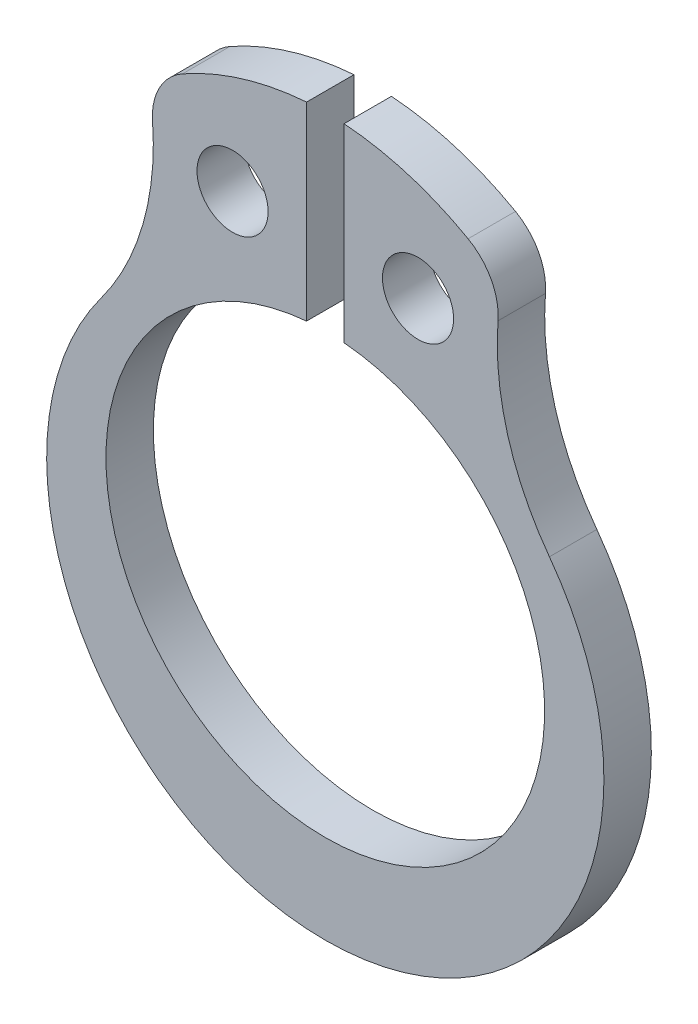
ISO-10303-21;
HEADER;
FILE_DESCRIPTION(('STEP AP214'),'2;1');
FILE_NAME('part.step','',(''),(''),'','','');
FILE_SCHEMA(('AUTOMOTIVE_DESIGN { 1 0 10303 214 1 1 1 1 }'));
ENDSEC;
DATA;
#1=APPLICATION_CONTEXT('core data for automotive mechanical design processes');
#2=APPLICATION_PROTOCOL_DEFINITION('international standard','automotive_design',2000,#1);
#3=PRODUCT_CONTEXT('',#1,'mechanical');
#4=PRODUCT('Part','Part','',(#3));
#5=PRODUCT_RELATED_PRODUCT_CATEGORY('part','',(#4));
#6=PRODUCT_DEFINITION_FORMATION('','',#4);
#7=PRODUCT_DEFINITION_CONTEXT('part definition',#1,'design');
#8=PRODUCT_DEFINITION('design','',#6,#7);
#9=PRODUCT_DEFINITION_SHAPE('','',#8);
#10=(LENGTH_UNIT() NAMED_UNIT(*) SI_UNIT(.MILLI.,.METRE.));
#11=(NAMED_UNIT(*) PLANE_ANGLE_UNIT() SI_UNIT($,.RADIAN.));
#12=(NAMED_UNIT(*) SI_UNIT($,.STERADIAN.) SOLID_ANGLE_UNIT());
#13=UNCERTAINTY_MEASURE_WITH_UNIT(LENGTH_MEASURE(1.E-05),#10,'distance_accuracy_value','');
#14=(GEOMETRIC_REPRESENTATION_CONTEXT(3) GLOBAL_UNCERTAINTY_ASSIGNED_CONTEXT((#13)) GLOBAL_UNIT_ASSIGNED_CONTEXT((#10,
#11,#12)) REPRESENTATION_CONTEXT('',''));
#15=CARTESIAN_POINT('',(0.,0.,0.));
#16=DIRECTION('',(0.,0.,1.));
#17=DIRECTION('',(1.,0.,0.));
#18=AXIS2_PLACEMENT_3D('',#15,#16,#17);
#19=CARTESIAN_POINT('',(0.0529035837753273,1.90010865412822,0.4));
#20=DIRECTION('',(0.,0.,1.));
#21=DIRECTION('',(1.,0.,0.));
#22=AXIS2_PLACEMENT_3D('',#19,#20,#21);
#23=PLANE('',#22);
#24=CARTESIAN_POINT('',(-1.56469076255837,4.95900623286204,0.4));
#25=DIRECTION('',(0.,0.,1.));
#26=DIRECTION('',(1.,0.,0.));
#27=AXIS2_PLACEMENT_3D('',#24,#25,#26);
#28=CIRCLE('',#27,0.6);
#29=CARTESIAN_POINT('',(-0.964690762558365,4.95900623286204,0.4));
#30=VERTEX_POINT('',#29);
#31=EDGE_CURVE('E150',#30,#30,#28,.T.);
#32=ORIENTED_EDGE('',*,*,#31,.F.);
#33=EDGE_LOOP('',(#32));
#34=FACE_BOUND('',#33,.T.);
#35=CARTESIAN_POINT('',(0.0529035837753273,1.90010865412822,0.4));
#36=DIRECTION('',(0.,0.,1.));
#37=DIRECTION('',(1.,0.,0.));
#38=AXIS2_PLACEMENT_3D('',#35,#36,#37);
#39=CIRCLE('',#38,5.);
#40=CARTESIAN_POINT('',(-0.31601290124631,6.88648014320516,0.4));
#41=VERTEX_POINT('',#40);
#42=CARTESIAN_POINT('',(-2.40895037591621,6.2520363972268,0.4));
#43=VERTEX_POINT('',#42);
#44=EDGE_CURVE('E165',#41,#43,#39,.T.);
#45=ORIENTED_EDGE('',*,*,#44,.T.);
#46=CARTESIAN_POINT('',(-1.9165795839779,5.38165084860709,0.4));
#47=DIRECTION('',(0.,0.,1.));
#48=DIRECTION('',(1.,0.,0.));
#49=AXIS2_PLACEMENT_3D('',#46,#47,#48);
#50=CIRCLE('',#49,0.999999999999999);
#51=CARTESIAN_POINT('',(-2.91370870399395,5.30593085114258,0.4));
#52=VERTEX_POINT('',#51);
#53=EDGE_CURVE('E103',#43,#52,#50,.T.);
#54=ORIENTED_EDGE('',*,*,#53,.T.);
#55=CARTESIAN_POINT('',(-7.40078974406616,4.9651908625523,0.4));
#56=DIRECTION('',(0.,0.,-1.));
#57=DIRECTION('',(-1.,0.,0.));
#58=AXIS2_PLACEMENT_3D('',#55,#56,#57);
#59=CIRCLE('',#58,4.5);
#60=CARTESIAN_POINT('',(-3.7808382388164,2.29199967978215,0.4));
#61=VERTEX_POINT('',#60);
#62=EDGE_CURVE('E186',#52,#61,#59,.T.);
#63=ORIENTED_EDGE('',*,*,#62,.T.);
#64=CARTESIAN_POINT('',(0.,-0.5,0.4));
#65=DIRECTION('',(0.,0.,1.));
#66=DIRECTION('',(1.,0.,0.));
#67=AXIS2_PLACEMENT_3D('',#64,#65,#66);
#68=CIRCLE('',#67,4.69999999999999);
#69=CARTESIAN_POINT('',(3.78083823881638,2.29199967978215,0.4));
#70=VERTEX_POINT('',#69);
#71=EDGE_CURVE('E205',#61,#70,#68,.T.);
#72=ORIENTED_EDGE('',*,*,#71,.T.);
#73=CARTESIAN_POINT('',(7.40078974406612,4.9651908625523,0.4));
#74=DIRECTION('',(0.,0.,-1.));
#75=DIRECTION('',(1.,0.,0.));
#76=AXIS2_PLACEMENT_3D('',#73,#74,#75);
#77=CIRCLE('',#76,4.49999999999999);
#78=CARTESIAN_POINT('',(2.91370870399391,5.30593085114258,0.4));
#79=VERTEX_POINT('',#78);
#80=EDGE_CURVE('E202',#70,#79,#77,.T.);
#81=ORIENTED_EDGE('',*,*,#80,.T.);
#82=CARTESIAN_POINT('',(1.91657958397786,5.38165084860709,0.4));
#83=DIRECTION('',(0.,0.,1.));
#84=DIRECTION('',(-1.,0.,0.));
#85=AXIS2_PLACEMENT_3D('',#82,#83,#84);
#86=CIRCLE('',#85,0.999999999999997);
#87=CARTESIAN_POINT('',(2.40895037591617,6.25203639722681,0.4));
#88=VERTEX_POINT('',#87);
#89=EDGE_CURVE('E204',#79,#88,#86,.T.);
#90=ORIENTED_EDGE('',*,*,#89,.T.);
#91=CARTESIAN_POINT('',(-0.0529035837753406,1.90010865412822,0.4));
#92=DIRECTION('',(0.,0.,1.));
#93=DIRECTION('',(-1.,0.,0.));
#94=AXIS2_PLACEMENT_3D('',#91,#92,#93);
#95=CIRCLE('',#94,4.99999999999999);
#96=CARTESIAN_POINT('',(0.316012901246262,6.88648014320516,0.4));
#97=VERTEX_POINT('',#96);
#98=EDGE_CURVE('E128',#88,#97,#95,.T.);
#99=ORIENTED_EDGE('',*,*,#98,.T.);
#100=DIRECTION('',(0.,-1.,0.));
#101=VECTOR('',#100,1.);
#102=CARTESIAN_POINT('',(0.316012901246262,6.88648014320516,0.4));
#103=LINE('',#102,#101);
#104=CARTESIAN_POINT('',(0.316012901246284,3.68648014320516,0.4));
#105=VERTEX_POINT('',#104);
#106=EDGE_CURVE('E122',#97,#105,#103,.T.);
#107=ORIENTED_EDGE('',*,*,#106,.T.);
#108=CARTESIAN_POINT('',(0.,0.,0.4));
#109=DIRECTION('',(0.,0.,-1.));
#110=DIRECTION('',(1.,0.,0.));
#111=AXIS2_PLACEMENT_3D('',#108,#109,#110);
#112=CIRCLE('',#111,3.7);
#113=CARTESIAN_POINT('',(-0.31601290124631,3.68648014320515,0.4));
#114=VERTEX_POINT('',#113);
#115=EDGE_CURVE('E126',#105,#114,#112,.T.);
#116=ORIENTED_EDGE('',*,*,#115,.T.);
#117=DIRECTION('',(0.,1.,0.));
#118=VECTOR('',#117,1.);
#119=CARTESIAN_POINT('',(-0.31601290124631,6.88648014320516,0.4));
#120=LINE('',#119,#118);
#121=EDGE_CURVE('E54',#114,#41,#120,.T.);
#122=ORIENTED_EDGE('',*,*,#121,.T.);
#123=EDGE_LOOP('',(#45,#54,#63,#72,#81,#90,#99,#107,#116,#122));
#124=FACE_BOUND('',#123,.T.);
#125=CARTESIAN_POINT('',(1.56469076255833,4.95900623286204,0.4));
#126=DIRECTION('',(0.,0.,1.));
#127=DIRECTION('',(-1.,0.,0.));
#128=AXIS2_PLACEMENT_3D('',#125,#126,#127);
#129=CIRCLE('',#128,0.600000000000001);
#130=CARTESIAN_POINT('',(0.96469076255833,4.95900623286204,0.4));
#131=VERTEX_POINT('',#130);
#132=EDGE_CURVE('E216',#131,#131,#129,.T.);
#133=ORIENTED_EDGE('',*,*,#132,.F.);
#134=EDGE_LOOP('',(#133));
#135=FACE_BOUND('',#134,.T.);
#136=ADVANCED_FACE('F37',(#34,#124,#135),#23,.T.);
#137=CARTESIAN_POINT('',(0.0529035837753273,1.90010865412822,-0.4));
#138=DIRECTION('',(0.,0.,1.));
#139=DIRECTION('',(1.,0.,0.));
#140=AXIS2_PLACEMENT_3D('',#137,#138,#139);
#141=PLANE('',#140);
#142=CARTESIAN_POINT('',(0.0529035837753273,1.90010865412822,-0.4));
#143=DIRECTION('',(0.,0.,1.));
#144=DIRECTION('',(1.,0.,0.));
#145=AXIS2_PLACEMENT_3D('',#142,#143,#144);
#146=CIRCLE('',#145,5.);
#147=CARTESIAN_POINT('',(-0.31601290124631,6.88648014320516,-0.4));
#148=VERTEX_POINT('',#147);
#149=CARTESIAN_POINT('',(-2.40895037591621,6.2520363972268,-0.4));
#150=VERTEX_POINT('',#149);
#151=EDGE_CURVE('E146',#148,#150,#146,.T.);
#152=ORIENTED_EDGE('',*,*,#151,.F.);
#153=DIRECTION('',(0.,1.,0.));
#154=VECTOR('',#153,1.);
#155=CARTESIAN_POINT('',(-0.31601290124631,6.88648014320516,-0.4));
#156=LINE('',#155,#154);
#157=CARTESIAN_POINT('',(-0.31601290124631,3.68648014320515,-0.4));
#158=VERTEX_POINT('',#157);
#159=EDGE_CURVE('E95',#158,#148,#156,.T.);
#160=ORIENTED_EDGE('',*,*,#159,.F.);
#161=CARTESIAN_POINT('',(0.,0.,-0.4));
#162=DIRECTION('',(0.,0.,-1.));
#163=DIRECTION('',(1.,0.,0.));
#164=AXIS2_PLACEMENT_3D('',#161,#162,#163);
#165=CIRCLE('',#164,3.7);
#166=CARTESIAN_POINT('',(0.316012901246284,3.68648014320516,-0.4));
#167=VERTEX_POINT('',#166);
#168=EDGE_CURVE('E89',#167,#158,#165,.T.);
#169=ORIENTED_EDGE('',*,*,#168,.F.);
#170=DIRECTION('',(0.,-1.,0.));
#171=VECTOR('',#170,1.);
#172=CARTESIAN_POINT('',(0.316012901246262,6.88648014320516,-0.4));
#173=LINE('',#172,#171);
#174=CARTESIAN_POINT('',(0.316012901246262,6.88648014320516,-0.4));
#175=VERTEX_POINT('',#174);
#176=EDGE_CURVE('E136',#175,#167,#173,.T.);
#177=ORIENTED_EDGE('',*,*,#176,.F.);
#178=CARTESIAN_POINT('',(-0.0529035837753406,1.90010865412822,-0.4));
#179=DIRECTION('',(0.,0.,1.));
#180=DIRECTION('',(-1.,0.,0.));
#181=AXIS2_PLACEMENT_3D('',#178,#179,#180);
#182=CIRCLE('',#181,4.99999999999999);
#183=CARTESIAN_POINT('',(2.40895037591617,6.25203639722681,-0.4));
#184=VERTEX_POINT('',#183);
#185=EDGE_CURVE('E160',#184,#175,#182,.T.);
#186=ORIENTED_EDGE('',*,*,#185,.F.);
#187=CARTESIAN_POINT('',(1.91657958397786,5.38165084860709,-0.4));
#188=DIRECTION('',(0.,0.,1.));
#189=DIRECTION('',(-1.,0.,0.));
#190=AXIS2_PLACEMENT_3D('',#187,#188,#189);
#191=CIRCLE('',#190,0.999999999999997);
#192=CARTESIAN_POINT('',(2.91370870399391,5.30593085114258,-0.4));
#193=VERTEX_POINT('',#192);
#194=EDGE_CURVE('E158',#193,#184,#191,.T.);
#195=ORIENTED_EDGE('',*,*,#194,.F.);
#196=CARTESIAN_POINT('',(7.40078974406612,4.9651908625523,-0.4));
#197=DIRECTION('',(0.,0.,-1.));
#198=DIRECTION('',(1.,0.,0.));
#199=AXIS2_PLACEMENT_3D('',#196,#197,#198);
#200=CIRCLE('',#199,4.49999999999999);
#201=CARTESIAN_POINT('',(3.78083823881638,2.29199967978215,-0.4));
#202=VERTEX_POINT('',#201);
#203=EDGE_CURVE('E156',#202,#193,#200,.T.);
#204=ORIENTED_EDGE('',*,*,#203,.F.);
#205=CARTESIAN_POINT('',(0.,-0.5,-0.4));
#206=DIRECTION('',(0.,0.,1.));
#207=DIRECTION('',(1.,0.,0.));
#208=AXIS2_PLACEMENT_3D('',#205,#206,#207);
#209=CIRCLE('',#208,4.69999999999999);
#210=CARTESIAN_POINT('',(-3.7808382388164,2.29199967978215,-0.4));
#211=VERTEX_POINT('',#210);
#212=EDGE_CURVE('E154',#211,#202,#209,.T.);
#213=ORIENTED_EDGE('',*,*,#212,.F.);
#214=CARTESIAN_POINT('',(-7.40078974406616,4.9651908625523,-0.4));
#215=DIRECTION('',(0.,0.,-1.));
#216=DIRECTION('',(-1.,0.,0.));
#217=AXIS2_PLACEMENT_3D('',#214,#215,#216);
#218=CIRCLE('',#217,4.5);
#219=CARTESIAN_POINT('',(-2.91370870399395,5.30593085114258,-0.4));
#220=VERTEX_POINT('',#219);
#221=EDGE_CURVE('E152',#220,#211,#218,.T.);
#222=ORIENTED_EDGE('',*,*,#221,.F.);
#223=CARTESIAN_POINT('',(-1.9165795839779,5.38165084860709,-0.4));
#224=DIRECTION('',(0.,0.,1.));
#225=DIRECTION('',(1.,0.,0.));
#226=AXIS2_PLACEMENT_3D('',#223,#224,#225);
#227=CIRCLE('',#226,0.999999999999999);
#228=EDGE_CURVE('E149',#150,#220,#227,.T.);
#229=ORIENTED_EDGE('',*,*,#228,.F.);
#230=EDGE_LOOP('',(#152,#160,#169,#177,#186,#195,#204,#213,#222,#229));
#231=FACE_BOUND('',#230,.T.);
#232=CARTESIAN_POINT('',(-1.56469076255837,4.95900623286204,-0.4));
#233=DIRECTION('',(0.,0.,1.));
#234=DIRECTION('',(1.,0.,0.));
#235=AXIS2_PLACEMENT_3D('',#232,#233,#234);
#236=CIRCLE('',#235,0.6);
#237=CARTESIAN_POINT('',(-0.964690762558365,4.95900623286204,-0.4));
#238=VERTEX_POINT('',#237);
#239=EDGE_CURVE('E213',#238,#238,#236,.T.);
#240=ORIENTED_EDGE('',*,*,#239,.T.);
#241=EDGE_LOOP('',(#240));
#242=FACE_BOUND('',#241,.T.);
#243=CARTESIAN_POINT('',(1.56469076255833,4.95900623286204,-0.4));
#244=DIRECTION('',(0.,0.,1.));
#245=DIRECTION('',(-1.,0.,0.));
#246=AXIS2_PLACEMENT_3D('',#243,#244,#245);
#247=CIRCLE('',#246,0.600000000000001);
#248=CARTESIAN_POINT('',(0.96469076255833,4.95900623286204,-0.4));
#249=VERTEX_POINT('',#248);
#250=EDGE_CURVE('E219',#249,#249,#247,.T.);
#251=ORIENTED_EDGE('',*,*,#250,.T.);
#252=EDGE_LOOP('',(#251));
#253=FACE_BOUND('',#252,.T.);
#254=ADVANCED_FACE('F190',(#231,#242,#253),#141,.F.);
#255=CARTESIAN_POINT('',(0.0529035837753273,1.90010865412822,0.4));
#256=DIRECTION('',(0.,0.,-1.));
#257=DIRECTION('',(-1.,0.,0.));
#258=AXIS2_PLACEMENT_3D('',#255,#256,#257);
#259=CYLINDRICAL_SURFACE('',#258,5.);
#260=ORIENTED_EDGE('',*,*,#151,.T.);
#261=DIRECTION('',(0.,0.,-1.));
#262=VECTOR('',#261,1.);
#263=CARTESIAN_POINT('',(-2.40895037591621,6.2520363972268,0.4));
#264=LINE('',#263,#262);
#265=EDGE_CURVE('E11',#43,#150,#264,.T.);
#266=ORIENTED_EDGE('',*,*,#265,.F.);
#267=ORIENTED_EDGE('',*,*,#44,.F.);
#268=DIRECTION('',(0.,0.,-1.));
#269=VECTOR('',#268,1.);
#270=CARTESIAN_POINT('',(-0.31601290124631,6.88648014320516,0.4));
#271=LINE('',#270,#269);
#272=EDGE_CURVE('E142',#41,#148,#271,.T.);
#273=ORIENTED_EDGE('',*,*,#272,.T.);
#274=EDGE_LOOP('',(#260,#266,#267,#273));
#275=FACE_BOUND('',#274,.T.);
#276=ADVANCED_FACE('F39',(#275),#259,.T.);
#277=CARTESIAN_POINT('',(-1.9165795839779,5.38165084860709,0.4));
#278=DIRECTION('',(0.,0.,-1.));
#279=DIRECTION('',(-1.,0.,0.));
#280=AXIS2_PLACEMENT_3D('',#277,#278,#279);
#281=CYLINDRICAL_SURFACE('',#280,0.999999999999999);
#282=ORIENTED_EDGE('',*,*,#228,.T.);
#283=DIRECTION('',(0.,0.,-1.));
#284=VECTOR('',#283,1.);
#285=CARTESIAN_POINT('',(-2.91370870399395,5.30593085114258,0.4));
#286=LINE('',#285,#284);
#287=EDGE_CURVE('E46',#52,#220,#286,.T.);
#288=ORIENTED_EDGE('',*,*,#287,.F.);
#289=ORIENTED_EDGE('',*,*,#53,.F.);
#290=ORIENTED_EDGE('',*,*,#265,.T.);
#291=EDGE_LOOP('',(#282,#288,#289,#290));
#292=FACE_BOUND('',#291,.T.);
#293=ADVANCED_FACE('F259',(#292),#281,.T.);
#294=CARTESIAN_POINT('',(-7.40078974406616,4.9651908625523,0.4));
#295=DIRECTION('',(0.,0.,-1.));
#296=DIRECTION('',(-1.,0.,0.));
#297=AXIS2_PLACEMENT_3D('',#294,#295,#296);
#298=CYLINDRICAL_SURFACE('',#297,4.5);
#299=ORIENTED_EDGE('',*,*,#221,.T.);
#300=DIRECTION('',(0.,0.,-1.));
#301=VECTOR('',#300,1.);
#302=CARTESIAN_POINT('',(-3.7808382388164,2.29199967978215,0.4));
#303=LINE('',#302,#301);
#304=EDGE_CURVE('E178',#61,#211,#303,.T.);
#305=ORIENTED_EDGE('',*,*,#304,.F.);
#306=ORIENTED_EDGE('',*,*,#62,.F.);
#307=ORIENTED_EDGE('',*,*,#287,.T.);
#308=EDGE_LOOP('',(#299,#305,#306,#307));
#309=FACE_BOUND('',#308,.T.);
#310=ADVANCED_FACE('F184',(#309),#298,.F.);
#311=CARTESIAN_POINT('',(0.,-0.5,0.4));
#312=DIRECTION('',(0.,0.,-1.));
#313=DIRECTION('',(-1.,0.,0.));
#314=AXIS2_PLACEMENT_3D('',#311,#312,#313);
#315=CYLINDRICAL_SURFACE('',#314,4.69999999999999);
#316=ORIENTED_EDGE('',*,*,#212,.T.);
#317=DIRECTION('',(0.,0.,-1.));
#318=VECTOR('',#317,1.);
#319=CARTESIAN_POINT('',(3.78083823881638,2.29199967978215,0.4));
#320=LINE('',#319,#318);
#321=EDGE_CURVE('E175',#70,#202,#320,.T.);
#322=ORIENTED_EDGE('',*,*,#321,.F.);
#323=ORIENTED_EDGE('',*,*,#71,.F.);
#324=ORIENTED_EDGE('',*,*,#304,.T.);
#325=EDGE_LOOP('',(#316,#322,#323,#324));
#326=FACE_BOUND('',#325,.T.);
#327=ADVANCED_FACE('F196',(#326),#315,.T.);
#328=CARTESIAN_POINT('',(7.40078974406612,4.9651908625523,0.4));
#329=DIRECTION('',(0.,0.,-1.));
#330=DIRECTION('',(-1.,0.,0.));
#331=AXIS2_PLACEMENT_3D('',#328,#329,#330);
#332=CYLINDRICAL_SURFACE('',#331,4.49999999999999);
#333=ORIENTED_EDGE('',*,*,#203,.T.);
#334=DIRECTION('',(0.,0.,-1.));
#335=VECTOR('',#334,1.);
#336=CARTESIAN_POINT('',(2.91370870399391,5.30593085114258,0.4));
#337=LINE('',#336,#335);
#338=EDGE_CURVE('E172',#79,#193,#337,.T.);
#339=ORIENTED_EDGE('',*,*,#338,.F.);
#340=ORIENTED_EDGE('',*,*,#80,.F.);
#341=ORIENTED_EDGE('',*,*,#321,.T.);
#342=EDGE_LOOP('',(#333,#339,#340,#341));
#343=FACE_BOUND('',#342,.T.);
#344=ADVANCED_FACE('F200',(#343),#332,.F.);
#345=CARTESIAN_POINT('',(1.91657958397786,5.38165084860709,0.4));
#346=DIRECTION('',(0.,0.,-1.));
#347=DIRECTION('',(-1.,0.,0.));
#348=AXIS2_PLACEMENT_3D('',#345,#346,#347);
#349=CYLINDRICAL_SURFACE('',#348,0.999999999999997);
#350=ORIENTED_EDGE('',*,*,#194,.T.);
#351=DIRECTION('',(0.,0.,-1.));
#352=VECTOR('',#351,1.);
#353=CARTESIAN_POINT('',(2.40895037591617,6.25203639722681,0.4));
#354=LINE('',#353,#352);
#355=EDGE_CURVE('E169',#88,#184,#354,.T.);
#356=ORIENTED_EDGE('',*,*,#355,.F.);
#357=ORIENTED_EDGE('',*,*,#89,.F.);
#358=ORIENTED_EDGE('',*,*,#338,.T.);
#359=EDGE_LOOP('',(#350,#356,#357,#358));
#360=FACE_BOUND('',#359,.T.);
#361=ADVANCED_FACE('F249',(#360),#349,.T.);
#362=CARTESIAN_POINT('',(-0.0529035837753406,1.90010865412822,0.4));
#363=DIRECTION('',(0.,0.,-1.));
#364=DIRECTION('',(-1.,0.,0.));
#365=AXIS2_PLACEMENT_3D('',#362,#363,#364);
#366=CYLINDRICAL_SURFACE('',#365,4.99999999999999);
#367=ORIENTED_EDGE('',*,*,#185,.T.);
#368=DIRECTION('',(0.,0.,-1.));
#369=VECTOR('',#368,1.);
#370=CARTESIAN_POINT('',(0.316012901246262,6.88648014320516,0.4));
#371=LINE('',#370,#369);
#372=EDGE_CURVE('E137',#97,#175,#371,.T.);
#373=ORIENTED_EDGE('',*,*,#372,.F.);
#374=ORIENTED_EDGE('',*,*,#98,.F.);
#375=ORIENTED_EDGE('',*,*,#355,.T.);
#376=EDGE_LOOP('',(#367,#373,#374,#375));
#377=FACE_BOUND('',#376,.T.);
#378=ADVANCED_FACE('F246',(#377),#366,.T.);
#379=CARTESIAN_POINT('',(0.316012901246262,6.88648014320516,0.4));
#380=DIRECTION('',(1.,0.,0.));
#381=DIRECTION('',(0.,1.,0.));
#382=AXIS2_PLACEMENT_3D('',#379,#380,#381);
#383=PLANE('',#382);
#384=ORIENTED_EDGE('',*,*,#176,.T.);
#385=DIRECTION('',(0.,0.,-1.));
#386=VECTOR('',#385,1.);
#387=CARTESIAN_POINT('',(0.316012901246284,3.68648014320516,0.4));
#388=LINE('',#387,#386);
#389=EDGE_CURVE('E133',#105,#167,#388,.T.);
#390=ORIENTED_EDGE('',*,*,#389,.F.);
#391=ORIENTED_EDGE('',*,*,#106,.F.);
#392=ORIENTED_EDGE('',*,*,#372,.T.);
#393=EDGE_LOOP('',(#384,#390,#391,#392));
#394=FACE_BOUND('',#393,.T.);
#395=ADVANCED_FACE('F134',(#394),#383,.F.);
#396=CARTESIAN_POINT('',(0.,0.,0.4));
#397=DIRECTION('',(0.,0.,-1.));
#398=DIRECTION('',(-1.,0.,0.));
#399=AXIS2_PLACEMENT_3D('',#396,#397,#398);
#400=CYLINDRICAL_SURFACE('',#399,3.7);
#401=ORIENTED_EDGE('',*,*,#168,.T.);
#402=DIRECTION('',(0.,0.,-1.));
#403=VECTOR('',#402,1.);
#404=CARTESIAN_POINT('',(-0.31601290124631,3.68648014320515,0.4));
#405=LINE('',#404,#403);
#406=EDGE_CURVE('E138',#114,#158,#405,.T.);
#407=ORIENTED_EDGE('',*,*,#406,.F.);
#408=ORIENTED_EDGE('',*,*,#115,.F.);
#409=ORIENTED_EDGE('',*,*,#389,.T.);
#410=EDGE_LOOP('',(#401,#407,#408,#409));
#411=FACE_BOUND('',#410,.T.);
#412=ADVANCED_FACE('F140',(#411),#400,.F.);
#413=CARTESIAN_POINT('',(-0.31601290124631,6.88648014320516,0.4));
#414=DIRECTION('',(-1.,0.,0.));
#415=DIRECTION('',(0.,-1.,0.));
#416=AXIS2_PLACEMENT_3D('',#413,#414,#415);
#417=PLANE('',#416);
#418=ORIENTED_EDGE('',*,*,#159,.T.);
#419=ORIENTED_EDGE('',*,*,#272,.F.);
#420=ORIENTED_EDGE('',*,*,#121,.F.);
#421=ORIENTED_EDGE('',*,*,#406,.T.);
#422=EDGE_LOOP('',(#418,#419,#420,#421));
#423=FACE_BOUND('',#422,.T.);
#424=ADVANCED_FACE('F239',(#423),#417,.F.);
#425=CARTESIAN_POINT('',(-1.56469076255837,4.95900623286204,0.4));
#426=DIRECTION('',(0.,0.,-1.));
#427=DIRECTION('',(-1.,0.,0.));
#428=AXIS2_PLACEMENT_3D('',#425,#426,#427);
#429=CYLINDRICAL_SURFACE('',#428,0.6);
#430=ORIENTED_EDGE('',*,*,#31,.T.);
#431=EDGE_LOOP('',(#430));
#432=FACE_BOUND('',#431,.T.);
#433=ORIENTED_EDGE('',*,*,#239,.F.);
#434=EDGE_LOOP('',(#433));
#435=FACE_BOUND('',#434,.T.);
#436=ADVANCED_FACE('F236',(#432,#435),#429,.F.);
#437=CARTESIAN_POINT('',(1.56469076255833,4.95900623286204,0.4));
#438=DIRECTION('',(0.,0.,-1.));
#439=DIRECTION('',(-1.,0.,0.));
#440=AXIS2_PLACEMENT_3D('',#437,#438,#439);
#441=CYLINDRICAL_SURFACE('',#440,0.600000000000001);
#442=ORIENTED_EDGE('',*,*,#132,.T.);
#443=EDGE_LOOP('',(#442));
#444=FACE_BOUND('',#443,.T.);
#445=ORIENTED_EDGE('',*,*,#250,.F.);
#446=EDGE_LOOP('',(#445));
#447=FACE_BOUND('',#446,.T.);
#448=ADVANCED_FACE('F225',(#444,#447),#441,.F.);
#449=CLOSED_SHELL('',(#136,#254,#276,#293,#310,#327,#344,#361,#378,#395,#412,#424,#436,#448));
#450=MANIFOLD_SOLID_BREP('B2',#449);
#451=ADVANCED_BREP_SHAPE_REPRESENTATION('',(#18,#450),#14);
#452=SHAPE_DEFINITION_REPRESENTATION(#9,#451);
ENDSEC;
END-ISO-10303-21;
